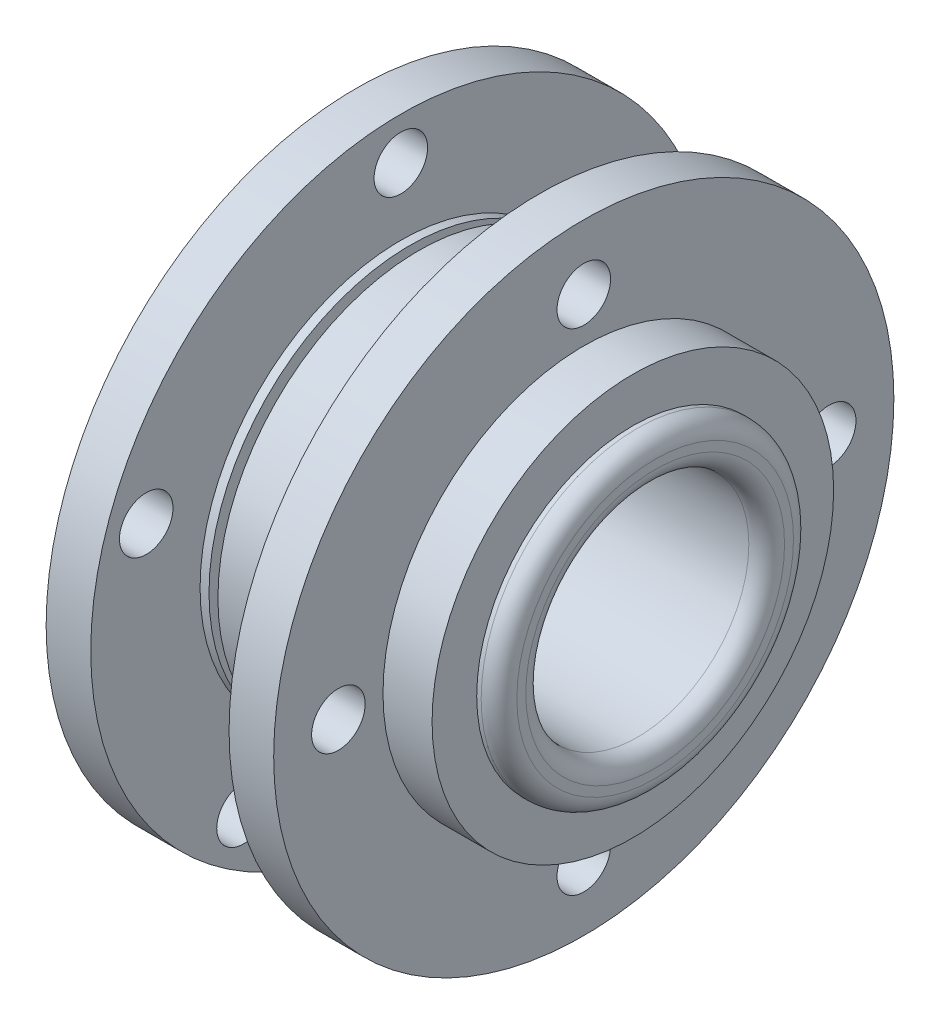
ISO-10303-21;
HEADER;
FILE_DESCRIPTION(('STEP AP214'),'2;1');
FILE_NAME('part.step','',(''),(''),'','','');
FILE_SCHEMA(('AUTOMOTIVE_DESIGN { 1 0 10303 214 1 1 1 1 }'));
ENDSEC;
DATA;
#1=APPLICATION_CONTEXT('core data for automotive mechanical design processes');
#2=APPLICATION_PROTOCOL_DEFINITION('international standard','automotive_design',2000,#1);
#3=PRODUCT_CONTEXT('',#1,'mechanical');
#4=PRODUCT('Part','Part','',(#3));
#5=PRODUCT_RELATED_PRODUCT_CATEGORY('part','',(#4));
#6=PRODUCT_DEFINITION_FORMATION('','',#4);
#7=PRODUCT_DEFINITION_CONTEXT('part definition',#1,'design');
#8=PRODUCT_DEFINITION('design','',#6,#7);
#9=PRODUCT_DEFINITION_SHAPE('','',#8);
#10=(LENGTH_UNIT() NAMED_UNIT(*) SI_UNIT(.MILLI.,.METRE.));
#11=(NAMED_UNIT(*) PLANE_ANGLE_UNIT() SI_UNIT($,.RADIAN.));
#12=(NAMED_UNIT(*) SI_UNIT($,.STERADIAN.) SOLID_ANGLE_UNIT());
#13=UNCERTAINTY_MEASURE_WITH_UNIT(LENGTH_MEASURE(1.E-05),#10,'distance_accuracy_value','');
#14=(GEOMETRIC_REPRESENTATION_CONTEXT(3) GLOBAL_UNCERTAINTY_ASSIGNED_CONTEXT((#13)) GLOBAL_UNIT_ASSIGNED_CONTEXT((#10,
#11,#12)) REPRESENTATION_CONTEXT('',''));
#15=CARTESIAN_POINT('',(0.,0.,0.));
#16=DIRECTION('',(0.,0.,1.));
#17=DIRECTION('',(1.,0.,0.));
#18=AXIS2_PLACEMENT_3D('',#15,#16,#17);
#19=CARTESIAN_POINT('',(0.,0.,0.));
#20=DIRECTION('',(-1.,0.,0.));
#21=DIRECTION('',(0.,0.,1.));
#22=AXIS2_PLACEMENT_3D('',#19,#20,#21);
#23=CYLINDRICAL_SURFACE('',#22,45.);
#24=CARTESIAN_POINT('',(25.,0.,0.));
#25=DIRECTION('',(-1.,0.,0.));
#26=DIRECTION('',(0.,0.,1.));
#27=AXIS2_PLACEMENT_3D('',#24,#25,#26);
#28=CIRCLE('',#27,45.);
#29=CARTESIAN_POINT('',(25.,0.,45.));
#30=VERTEX_POINT('',#29);
#31=EDGE_CURVE('E80',#30,#30,#28,.T.);
#32=ORIENTED_EDGE('',*,*,#31,.F.);
#33=EDGE_LOOP('',(#32));
#34=FACE_BOUND('',#33,.T.);
#35=CARTESIAN_POINT('',(27.,0.,0.));
#36=DIRECTION('',(-1.,0.,0.));
#37=DIRECTION('',(0.,0.,1.));
#38=AXIS2_PLACEMENT_3D('',#35,#36,#37);
#39=CIRCLE('',#38,45.);
#40=CARTESIAN_POINT('',(27.,0.,45.));
#41=VERTEX_POINT('',#40);
#42=EDGE_CURVE('E201',#41,#41,#39,.T.);
#43=ORIENTED_EDGE('',*,*,#42,.T.);
#44=EDGE_LOOP('',(#43));
#45=FACE_BOUND('',#44,.T.);
#46=ADVANCED_FACE('F36',(#34,#45),#23,.T.);
#47=CARTESIAN_POINT('',(56.,0.,0.));
#48=DIRECTION('',(-1.,0.,0.));
#49=DIRECTION('',(0.,0.,1.));
#50=AXIS2_PLACEMENT_3D('',#47,#48,#49);
#51=CIRCLE('',#50,45.);
#52=CARTESIAN_POINT('',(56.,0.,45.));
#53=VERTEX_POINT('',#52);
#54=EDGE_CURVE('E76',#53,#53,#51,.T.);
#55=ORIENTED_EDGE('',*,*,#54,.T.);
#56=EDGE_LOOP('',(#55));
#57=FACE_BOUND('',#56,.T.);
#58=CARTESIAN_POINT('',(29.,0.,0.));
#59=DIRECTION('',(-1.,0.,0.));
#60=DIRECTION('',(0.,0.,1.));
#61=AXIS2_PLACEMENT_3D('',#58,#59,#60);
#62=CIRCLE('',#61,45.);
#63=CARTESIAN_POINT('',(29.,0.,45.));
#64=VERTEX_POINT('',#63);
#65=EDGE_CURVE('E197',#64,#64,#62,.T.);
#66=ORIENTED_EDGE('',*,*,#65,.F.);
#67=EDGE_LOOP('',(#66));
#68=FACE_BOUND('',#67,.T.);
#69=ADVANCED_FACE('F222',(#57,#68),#23,.T.);
#70=CARTESIAN_POINT('',(0.,0.,0.));
#71=DIRECTION('',(-1.,0.,0.));
#72=DIRECTION('',(0.,0.,1.));
#73=AXIS2_PLACEMENT_3D('',#70,#71,#72);
#74=CYLINDRICAL_SURFACE('',#73,45.);
#75=CARTESIAN_POINT('',(66.,0.,0.));
#76=DIRECTION('',(-1.,0.,0.));
#77=DIRECTION('',(0.,0.,1.));
#78=AXIS2_PLACEMENT_3D('',#75,#76,#77);
#79=CIRCLE('',#78,45.);
#80=CARTESIAN_POINT('',(66.,0.,45.));
#81=VERTEX_POINT('',#80);
#82=EDGE_CURVE('E64',#81,#81,#79,.T.);
#83=ORIENTED_EDGE('',*,*,#82,.F.);
#84=EDGE_LOOP('',(#83));
#85=FACE_BOUND('',#84,.T.);
#86=CARTESIAN_POINT('',(77.,0.,0.));
#87=DIRECTION('',(1.,0.,0.));
#88=DIRECTION('',(0.,0.,-1.));
#89=AXIS2_PLACEMENT_3D('',#86,#87,#88);
#90=CIRCLE('',#89,45.);
#91=CARTESIAN_POINT('',(77.,0.,-45.));
#92=VERTEX_POINT('',#91);
#93=EDGE_CURVE('E174',#92,#92,#90,.T.);
#94=ORIENTED_EDGE('',*,*,#93,.F.);
#95=EDGE_LOOP('',(#94));
#96=FACE_BOUND('',#95,.T.);
#97=ADVANCED_FACE('F228',(#85,#96),#74,.T.);
#98=CARTESIAN_POINT('',(66.,45.,0.));
#99=DIRECTION('',(-1.,0.,0.));
#100=DIRECTION('',(0.,0.,1.));
#101=AXIS2_PLACEMENT_3D('',#98,#99,#100);
#102=PLANE('',#101);
#103=CARTESIAN_POINT('',(66.,55.,0.));
#104=DIRECTION('',(1.,0.,0.));
#105=DIRECTION('',(0.,0.,-1.));
#106=AXIS2_PLACEMENT_3D('',#103,#104,#105);
#107=CIRCLE('',#106,6.);
#108=CARTESIAN_POINT('',(66.,55.,-6.));
#109=VERTEX_POINT('',#108);
#110=EDGE_CURVE('E124',#109,#109,#107,.T.);
#111=ORIENTED_EDGE('',*,*,#110,.F.);
#112=EDGE_LOOP('',(#111));
#113=FACE_BOUND('',#112,.T.);
#114=CARTESIAN_POINT('',(66.,1.55309068257925E-12,-55.0000000000016));
#115=DIRECTION('',(1.,0.,0.));
#116=DIRECTION('',(0.,0.,-1.));
#117=AXIS2_PLACEMENT_3D('',#114,#115,#116);
#118=CIRCLE('',#117,6.00000000000121);
#119=CARTESIAN_POINT('',(66.,1.55309068257925E-12,-61.0000000000028));
#120=VERTEX_POINT('',#119);
#121=EDGE_CURVE('E116',#120,#120,#118,.T.);
#122=ORIENTED_EDGE('',*,*,#121,.F.);
#123=EDGE_LOOP('',(#122));
#124=FACE_BOUND('',#123,.T.);
#125=CARTESIAN_POINT('',(66.,-55.,-3.10618136515851E-12));
#126=DIRECTION('',(1.,0.,0.));
#127=DIRECTION('',(0.,0.,-1.));
#128=AXIS2_PLACEMENT_3D('',#125,#126,#127);
#129=CIRCLE('',#128,6.00000000000334);
#130=CARTESIAN_POINT('',(66.,-55.,-6.00000000000644));
#131=VERTEX_POINT('',#130);
#132=EDGE_CURVE('E109',#131,#131,#129,.T.);
#133=ORIENTED_EDGE('',*,*,#132,.F.);
#134=EDGE_LOOP('',(#133));
#135=FACE_BOUND('',#134,.T.);
#136=CARTESIAN_POINT('',(66.,-1.55982623997457E-12,54.9999999999985));
#137=DIRECTION('',(1.,0.,0.));
#138=DIRECTION('',(0.,0.,-1.));
#139=AXIS2_PLACEMENT_3D('',#136,#137,#138);
#140=CIRCLE('',#139,6.00000000000249);
#141=CARTESIAN_POINT('',(66.,-1.55982623997457E-12,48.999999999996));
#142=VERTEX_POINT('',#141);
#143=EDGE_CURVE('E100',#142,#142,#140,.T.);
#144=ORIENTED_EDGE('',*,*,#143,.F.);
#145=EDGE_LOOP('',(#144));
#146=FACE_BOUND('',#145,.T.);
#147=CARTESIAN_POINT('',(66.,0.,0.));
#148=DIRECTION('',(-1.,0.,0.));
#149=DIRECTION('',(0.,0.,1.));
#150=AXIS2_PLACEMENT_3D('',#147,#148,#149);
#151=CIRCLE('',#150,69.5);
#152=CARTESIAN_POINT('',(66.,0.,69.5));
#153=VERTEX_POINT('',#152);
#154=EDGE_CURVE('E68',#153,#153,#151,.T.);
#155=ORIENTED_EDGE('',*,*,#154,.F.);
#156=EDGE_LOOP('',(#155));
#157=FACE_BOUND('',#156,.T.);
#158=ORIENTED_EDGE('',*,*,#82,.T.);
#159=EDGE_LOOP('',(#158));
#160=FACE_BOUND('',#159,.T.);
#161=ADVANCED_FACE('F242',(#113,#124,#135,#146,#157,#160),#102,.F.);
#162=CARTESIAN_POINT('',(0.,0.,0.));
#163=DIRECTION('',(-1.,0.,0.));
#164=DIRECTION('',(0.,0.,1.));
#165=AXIS2_PLACEMENT_3D('',#162,#163,#164);
#166=CYLINDRICAL_SURFACE('',#165,69.5);
#167=CARTESIAN_POINT('',(56.,0.,0.));
#168=DIRECTION('',(-1.,0.,0.));
#169=DIRECTION('',(0.,0.,1.));
#170=AXIS2_PLACEMENT_3D('',#167,#168,#169);
#171=CIRCLE('',#170,69.5);
#172=CARTESIAN_POINT('',(56.,0.,69.5));
#173=VERTEX_POINT('',#172);
#174=EDGE_CURVE('E72',#173,#173,#171,.T.);
#175=ORIENTED_EDGE('',*,*,#174,.F.);
#176=EDGE_LOOP('',(#175));
#177=FACE_BOUND('',#176,.T.);
#178=ORIENTED_EDGE('',*,*,#154,.T.);
#179=EDGE_LOOP('',(#178));
#180=FACE_BOUND('',#179,.T.);
#181=ADVANCED_FACE('F238',(#177,#180),#166,.T.);
#182=CARTESIAN_POINT('',(56.,69.5,0.));
#183=DIRECTION('',(1.,0.,0.));
#184=DIRECTION('',(0.,0.,-1.));
#185=AXIS2_PLACEMENT_3D('',#182,#183,#184);
#186=PLANE('',#185);
#187=CARTESIAN_POINT('',(56.,55.,0.));
#188=DIRECTION('',(1.,0.,0.));
#189=DIRECTION('',(0.,0.,-1.));
#190=AXIS2_PLACEMENT_3D('',#187,#188,#189);
#191=CIRCLE('',#190,6.);
#192=CARTESIAN_POINT('',(56.,55.,-6.));
#193=VERTEX_POINT('',#192);
#194=EDGE_CURVE('E99',#193,#193,#191,.T.);
#195=ORIENTED_EDGE('',*,*,#194,.T.);
#196=EDGE_LOOP('',(#195));
#197=FACE_BOUND('',#196,.T.);
#198=CARTESIAN_POINT('',(56.,1.55309068257925E-12,-55.0000000000016));
#199=DIRECTION('',(1.,0.,0.));
#200=DIRECTION('',(0.,0.,-1.));
#201=AXIS2_PLACEMENT_3D('',#198,#199,#200);
#202=CIRCLE('',#201,6.00000000000121);
#203=CARTESIAN_POINT('',(56.,1.55309068257925E-12,-61.0000000000028));
#204=VERTEX_POINT('',#203);
#205=EDGE_CURVE('E120',#204,#204,#202,.T.);
#206=ORIENTED_EDGE('',*,*,#205,.T.);
#207=EDGE_LOOP('',(#206));
#208=FACE_BOUND('',#207,.T.);
#209=CARTESIAN_POINT('',(56.,-55.,-3.10618136515851E-12));
#210=DIRECTION('',(1.,0.,0.));
#211=DIRECTION('',(0.,0.,-1.));
#212=AXIS2_PLACEMENT_3D('',#209,#210,#211);
#213=CIRCLE('',#212,6.00000000000334);
#214=CARTESIAN_POINT('',(56.,-55.,-6.00000000000644));
#215=VERTEX_POINT('',#214);
#216=EDGE_CURVE('E113',#215,#215,#213,.T.);
#217=ORIENTED_EDGE('',*,*,#216,.T.);
#218=EDGE_LOOP('',(#217));
#219=FACE_BOUND('',#218,.T.);
#220=CARTESIAN_POINT('',(56.,-1.55982623997457E-12,54.9999999999985));
#221=DIRECTION('',(1.,0.,0.));
#222=DIRECTION('',(0.,0.,-1.));
#223=AXIS2_PLACEMENT_3D('',#220,#221,#222);
#224=CIRCLE('',#223,6.00000000000249);
#225=CARTESIAN_POINT('',(56.,-1.55982623997457E-12,48.999999999996));
#226=VERTEX_POINT('',#225);
#227=EDGE_CURVE('E104',#226,#226,#224,.T.);
#228=ORIENTED_EDGE('',*,*,#227,.T.);
#229=EDGE_LOOP('',(#228));
#230=FACE_BOUND('',#229,.T.);
#231=ORIENTED_EDGE('',*,*,#54,.F.);
#232=EDGE_LOOP('',(#231));
#233=FACE_BOUND('',#232,.T.);
#234=ORIENTED_EDGE('',*,*,#174,.T.);
#235=EDGE_LOOP('',(#234));
#236=FACE_BOUND('',#235,.T.);
#237=ADVANCED_FACE('F235',(#197,#208,#219,#230,#233,#236),#186,.F.);
#238=CARTESIAN_POINT('',(25.,45.,0.));
#239=DIRECTION('',(-1.,0.,0.));
#240=DIRECTION('',(0.,0.,1.));
#241=AXIS2_PLACEMENT_3D('',#238,#239,#240);
#242=PLANE('',#241);
#243=CARTESIAN_POINT('',(25.,60.,0.));
#244=DIRECTION('',(-1.,0.,0.));
#245=DIRECTION('',(0.,0.,1.));
#246=AXIS2_PLACEMENT_3D('',#243,#244,#245);
#247=CIRCLE('',#246,6.);
#248=CARTESIAN_POINT('',(25.,60.,6.));
#249=VERTEX_POINT('',#248);
#250=EDGE_CURVE('E105',#249,#249,#247,.T.);
#251=ORIENTED_EDGE('',*,*,#250,.T.);
#252=EDGE_LOOP('',(#251));
#253=FACE_BOUND('',#252,.T.);
#254=CARTESIAN_POINT('',(25.,18.5410196624993,57.063390977711));
#255=DIRECTION('',(-1.,0.,0.));
#256=DIRECTION('',(0.,0.,1.));
#257=AXIS2_PLACEMENT_3D('',#254,#255,#256);
#258=CIRCLE('',#257,6.00000000000114);
#259=CARTESIAN_POINT('',(25.,18.5410196624993,63.0633909777121));
#260=VERTEX_POINT('',#259);
#261=EDGE_CURVE('E159',#260,#260,#258,.T.);
#262=ORIENTED_EDGE('',*,*,#261,.T.);
#263=EDGE_LOOP('',(#262));
#264=FACE_BOUND('',#263,.T.);
#265=CARTESIAN_POINT('',(25.,-48.5410196624954,35.267115137553));
#266=DIRECTION('',(-1.,0.,0.));
#267=DIRECTION('',(0.,0.,1.));
#268=AXIS2_PLACEMENT_3D('',#265,#266,#267);
#269=CIRCLE('',#268,6.00000000000428);
#270=CARTESIAN_POINT('',(25.,-48.5410196624954,41.2671151375573));
#271=VERTEX_POINT('',#270);
#272=EDGE_CURVE('E151',#271,#271,#269,.T.);
#273=ORIENTED_EDGE('',*,*,#272,.T.);
#274=EDGE_LOOP('',(#273));
#275=FACE_BOUND('',#274,.T.);
#276=CARTESIAN_POINT('',(25.,-48.5410196624983,-35.2671151375438));
#277=DIRECTION('',(-1.,0.,0.));
#278=DIRECTION('',(0.,0.,1.));
#279=AXIS2_PLACEMENT_3D('',#276,#277,#278);
#280=CIRCLE('',#279,6.00000000000533);
#281=CARTESIAN_POINT('',(25.,-48.5410196624983,-29.2671151375385));
#282=VERTEX_POINT('',#281);
#283=EDGE_CURVE('E143',#282,#282,#280,.T.);
#284=ORIENTED_EDGE('',*,*,#283,.T.);
#285=EDGE_LOOP('',(#284));
#286=FACE_BOUND('',#285,.T.);
#287=CARTESIAN_POINT('',(25.,18.5410196624944,-57.0633909777075));
#288=DIRECTION('',(-1.,0.,0.));
#289=DIRECTION('',(0.,0.,1.));
#290=AXIS2_PLACEMENT_3D('',#287,#288,#289);
#291=CIRCLE('',#290,6.00000000000305);
#292=CARTESIAN_POINT('',(25.,18.5410196624944,-51.0633909777044));
#293=VERTEX_POINT('',#292);
#294=EDGE_CURVE('E135',#293,#293,#291,.T.);
#295=ORIENTED_EDGE('',*,*,#294,.T.);
#296=EDGE_LOOP('',(#295));
#297=FACE_BOUND('',#296,.T.);
#298=CARTESIAN_POINT('',(25.,0.,0.));
#299=DIRECTION('',(-1.,0.,0.));
#300=DIRECTION('',(0.,0.,1.));
#301=AXIS2_PLACEMENT_3D('',#298,#299,#300);
#302=CIRCLE('',#301,69.5);
#303=CARTESIAN_POINT('',(25.,0.,69.5));
#304=VERTEX_POINT('',#303);
#305=EDGE_CURVE('E84',#304,#304,#302,.T.);
#306=ORIENTED_EDGE('',*,*,#305,.F.);
#307=EDGE_LOOP('',(#306));
#308=FACE_BOUND('',#307,.T.);
#309=ORIENTED_EDGE('',*,*,#31,.T.);
#310=EDGE_LOOP('',(#309));
#311=FACE_BOUND('',#310,.T.);
#312=ADVANCED_FACE('F233',(#253,#264,#275,#286,#297,#308,#311),#242,.F.);
#313=CARTESIAN_POINT('',(0.,0.,0.));
#314=DIRECTION('',(-1.,0.,0.));
#315=DIRECTION('',(0.,0.,1.));
#316=AXIS2_PLACEMENT_3D('',#313,#314,#315);
#317=CYLINDRICAL_SURFACE('',#316,69.5);
#318=CARTESIAN_POINT('',(15.,0.,0.));
#319=DIRECTION('',(-1.,0.,0.));
#320=DIRECTION('',(0.,0.,1.));
#321=AXIS2_PLACEMENT_3D('',#318,#319,#320);
#322=CIRCLE('',#321,69.5);
#323=CARTESIAN_POINT('',(15.,0.,69.5));
#324=VERTEX_POINT('',#323);
#325=EDGE_CURVE('E88',#324,#324,#322,.T.);
#326=ORIENTED_EDGE('',*,*,#325,.F.);
#327=EDGE_LOOP('',(#326));
#328=FACE_BOUND('',#327,.T.);
#329=ORIENTED_EDGE('',*,*,#305,.T.);
#330=EDGE_LOOP('',(#329));
#331=FACE_BOUND('',#330,.T.);
#332=ADVANCED_FACE('F329',(#328,#331),#317,.T.);
#333=CARTESIAN_POINT('',(15.,69.5,0.));
#334=DIRECTION('',(1.,0.,0.));
#335=DIRECTION('',(0.,0.,-1.));
#336=AXIS2_PLACEMENT_3D('',#333,#334,#335);
#337=PLANE('',#336);
#338=CARTESIAN_POINT('',(15.,60.,0.));
#339=DIRECTION('',(-1.,0.,0.));
#340=DIRECTION('',(0.,0.,1.));
#341=AXIS2_PLACEMENT_3D('',#338,#339,#340);
#342=CIRCLE('',#341,6.);
#343=CARTESIAN_POINT('',(15.,60.,6.));
#344=VERTEX_POINT('',#343);
#345=EDGE_CURVE('E163',#344,#344,#342,.T.);
#346=ORIENTED_EDGE('',*,*,#345,.F.);
#347=EDGE_LOOP('',(#346));
#348=FACE_BOUND('',#347,.T.);
#349=CARTESIAN_POINT('',(15.,18.5410196624993,57.063390977711));
#350=DIRECTION('',(-1.,0.,0.));
#351=DIRECTION('',(0.,0.,1.));
#352=AXIS2_PLACEMENT_3D('',#349,#350,#351);
#353=CIRCLE('',#352,6.00000000000114);
#354=CARTESIAN_POINT('',(15.,18.5410196624993,63.0633909777121));
#355=VERTEX_POINT('',#354);
#356=EDGE_CURVE('E155',#355,#355,#353,.T.);
#357=ORIENTED_EDGE('',*,*,#356,.F.);
#358=EDGE_LOOP('',(#357));
#359=FACE_BOUND('',#358,.T.);
#360=CARTESIAN_POINT('',(15.,-48.5410196624954,35.267115137553));
#361=DIRECTION('',(-1.,0.,0.));
#362=DIRECTION('',(0.,0.,1.));
#363=AXIS2_PLACEMENT_3D('',#360,#361,#362);
#364=CIRCLE('',#363,6.00000000000428);
#365=CARTESIAN_POINT('',(15.,-48.5410196624954,41.2671151375573));
#366=VERTEX_POINT('',#365);
#367=EDGE_CURVE('E147',#366,#366,#364,.T.);
#368=ORIENTED_EDGE('',*,*,#367,.F.);
#369=EDGE_LOOP('',(#368));
#370=FACE_BOUND('',#369,.T.);
#371=CARTESIAN_POINT('',(15.,-48.5410196624983,-35.2671151375438));
#372=DIRECTION('',(-1.,0.,0.));
#373=DIRECTION('',(0.,0.,1.));
#374=AXIS2_PLACEMENT_3D('',#371,#372,#373);
#375=CIRCLE('',#374,6.00000000000533);
#376=CARTESIAN_POINT('',(15.,-48.5410196624983,-29.2671151375385));
#377=VERTEX_POINT('',#376);
#378=EDGE_CURVE('E140',#377,#377,#375,.T.);
#379=ORIENTED_EDGE('',*,*,#378,.F.);
#380=EDGE_LOOP('',(#379));
#381=FACE_BOUND('',#380,.T.);
#382=CARTESIAN_POINT('',(15.,18.5410196624944,-57.0633909777075));
#383=DIRECTION('',(-1.,0.,0.));
#384=DIRECTION('',(0.,0.,1.));
#385=AXIS2_PLACEMENT_3D('',#382,#383,#384);
#386=CIRCLE('',#385,6.00000000000305);
#387=CARTESIAN_POINT('',(15.,18.5410196624944,-51.0633909777044));
#388=VERTEX_POINT('',#387);
#389=EDGE_CURVE('E131',#388,#388,#386,.T.);
#390=ORIENTED_EDGE('',*,*,#389,.F.);
#391=EDGE_LOOP('',(#390));
#392=FACE_BOUND('',#391,.T.);
#393=CARTESIAN_POINT('',(15.,0.,0.));
#394=DIRECTION('',(-1.,0.,0.));
#395=DIRECTION('',(0.,0.,1.));
#396=AXIS2_PLACEMENT_3D('',#393,#394,#395);
#397=CIRCLE('',#396,39.5);
#398=CARTESIAN_POINT('',(15.,0.,39.5));
#399=VERTEX_POINT('',#398);
#400=EDGE_CURVE('E92',#399,#399,#397,.T.);
#401=ORIENTED_EDGE('',*,*,#400,.F.);
#402=EDGE_LOOP('',(#401));
#403=FACE_BOUND('',#402,.T.);
#404=ORIENTED_EDGE('',*,*,#325,.T.);
#405=EDGE_LOOP('',(#404));
#406=FACE_BOUND('',#405,.T.);
#407=ADVANCED_FACE('F326',(#348,#359,#370,#381,#392,#403,#406),#337,.F.);
#408=CARTESIAN_POINT('',(0.,0.,0.));
#409=DIRECTION('',(-1.,0.,0.));
#410=DIRECTION('',(0.,0.,1.));
#411=AXIS2_PLACEMENT_3D('',#408,#409,#410);
#412=CYLINDRICAL_SURFACE('',#411,39.5);
#413=CARTESIAN_POINT('',(0.,0.,0.));
#414=DIRECTION('',(-1.,0.,0.));
#415=DIRECTION('',(0.,0.,1.));
#416=AXIS2_PLACEMENT_3D('',#413,#414,#415);
#417=CIRCLE('',#416,39.5);
#418=CARTESIAN_POINT('',(0.,0.,39.5));
#419=VERTEX_POINT('',#418);
#420=EDGE_CURVE('E96',#419,#419,#417,.T.);
#421=ORIENTED_EDGE('',*,*,#420,.F.);
#422=EDGE_LOOP('',(#421));
#423=FACE_BOUND('',#422,.T.);
#424=ORIENTED_EDGE('',*,*,#400,.T.);
#425=EDGE_LOOP('',(#424));
#426=FACE_BOUND('',#425,.T.);
#427=ADVANCED_FACE('F322',(#423,#426),#412,.T.);
#428=CARTESIAN_POINT('',(0.,39.5,0.));
#429=DIRECTION('',(1.,0.,0.));
#430=DIRECTION('',(0.,0.,-1.));
#431=AXIS2_PLACEMENT_3D('',#428,#429,#430);
#432=PLANE('',#431);
#433=CARTESIAN_POINT('',(0.,0.,0.));
#434=DIRECTION('',(-1.,0.,0.));
#435=DIRECTION('',(0.,0.,1.));
#436=AXIS2_PLACEMENT_3D('',#433,#434,#435);
#437=CIRCLE('',#436,35.);
#438=CARTESIAN_POINT('',(0.,0.,35.));
#439=VERTEX_POINT('',#438);
#440=EDGE_CURVE('E170',#439,#439,#437,.T.);
#441=ORIENTED_EDGE('',*,*,#440,.F.);
#442=EDGE_LOOP('',(#441));
#443=FACE_BOUND('',#442,.T.);
#444=ORIENTED_EDGE('',*,*,#420,.T.);
#445=EDGE_LOOP('',(#444));
#446=FACE_BOUND('',#445,.T.);
#447=ADVANCED_FACE('F318',(#443,#446),#432,.F.);
#448=CARTESIAN_POINT('',(56.,-1.55982623997457E-12,54.9999999999985));
#449=DIRECTION('',(1.,0.,0.));
#450=DIRECTION('',(0.,0.,-1.));
#451=AXIS2_PLACEMENT_3D('',#448,#449,#450);
#452=CYLINDRICAL_SURFACE('',#451,6.00000000000249);
#453=ORIENTED_EDGE('',*,*,#227,.F.);
#454=EDGE_LOOP('',(#453));
#455=FACE_BOUND('',#454,.T.);
#456=ORIENTED_EDGE('',*,*,#143,.T.);
#457=EDGE_LOOP('',(#456));
#458=FACE_BOUND('',#457,.T.);
#459=ADVANCED_FACE('F314',(#455,#458),#452,.F.);
#460=CARTESIAN_POINT('',(56.,-55.,-3.10618136515851E-12));
#461=DIRECTION('',(1.,0.,0.));
#462=DIRECTION('',(0.,0.,-1.));
#463=AXIS2_PLACEMENT_3D('',#460,#461,#462);
#464=CYLINDRICAL_SURFACE('',#463,6.00000000000334);
#465=ORIENTED_EDGE('',*,*,#216,.F.);
#466=EDGE_LOOP('',(#465));
#467=FACE_BOUND('',#466,.T.);
#468=ORIENTED_EDGE('',*,*,#132,.T.);
#469=EDGE_LOOP('',(#468));
#470=FACE_BOUND('',#469,.T.);
#471=ADVANCED_FACE('F310',(#467,#470),#464,.F.);
#472=CARTESIAN_POINT('',(56.,1.55309068257925E-12,-55.0000000000016));
#473=DIRECTION('',(1.,0.,0.));
#474=DIRECTION('',(0.,0.,-1.));
#475=AXIS2_PLACEMENT_3D('',#472,#473,#474);
#476=CYLINDRICAL_SURFACE('',#475,6.00000000000121);
#477=ORIENTED_EDGE('',*,*,#205,.F.);
#478=EDGE_LOOP('',(#477));
#479=FACE_BOUND('',#478,.T.);
#480=ORIENTED_EDGE('',*,*,#121,.T.);
#481=EDGE_LOOP('',(#480));
#482=FACE_BOUND('',#481,.T.);
#483=ADVANCED_FACE('F306',(#479,#482),#476,.F.);
#484=CARTESIAN_POINT('',(56.,55.,0.));
#485=DIRECTION('',(1.,0.,0.));
#486=DIRECTION('',(0.,0.,-1.));
#487=AXIS2_PLACEMENT_3D('',#484,#485,#486);
#488=CYLINDRICAL_SURFACE('',#487,6.);
#489=ORIENTED_EDGE('',*,*,#194,.F.);
#490=EDGE_LOOP('',(#489));
#491=FACE_BOUND('',#490,.T.);
#492=ORIENTED_EDGE('',*,*,#110,.T.);
#493=EDGE_LOOP('',(#492));
#494=FACE_BOUND('',#493,.T.);
#495=ADVANCED_FACE('F302',(#491,#494),#488,.F.);
#496=CARTESIAN_POINT('',(25.,18.5410196624944,-57.0633909777075));
#497=DIRECTION('',(-1.,0.,0.));
#498=DIRECTION('',(0.,0.,1.));
#499=AXIS2_PLACEMENT_3D('',#496,#497,#498);
#500=CYLINDRICAL_SURFACE('',#499,6.00000000000305);
#501=ORIENTED_EDGE('',*,*,#294,.F.);
#502=EDGE_LOOP('',(#501));
#503=FACE_BOUND('',#502,.T.);
#504=ORIENTED_EDGE('',*,*,#389,.T.);
#505=EDGE_LOOP('',(#504));
#506=FACE_BOUND('',#505,.T.);
#507=ADVANCED_FACE('F298',(#503,#506),#500,.F.);
#508=CARTESIAN_POINT('',(25.,-48.5410196624983,-35.2671151375438));
#509=DIRECTION('',(-1.,0.,0.));
#510=DIRECTION('',(0.,0.,1.));
#511=AXIS2_PLACEMENT_3D('',#508,#509,#510);
#512=CYLINDRICAL_SURFACE('',#511,6.00000000000533);
#513=ORIENTED_EDGE('',*,*,#283,.F.);
#514=EDGE_LOOP('',(#513));
#515=FACE_BOUND('',#514,.T.);
#516=ORIENTED_EDGE('',*,*,#378,.T.);
#517=EDGE_LOOP('',(#516));
#518=FACE_BOUND('',#517,.T.);
#519=ADVANCED_FACE('F294',(#515,#518),#512,.F.);
#520=CARTESIAN_POINT('',(25.,-48.5410196624954,35.267115137553));
#521=DIRECTION('',(-1.,0.,0.));
#522=DIRECTION('',(0.,0.,1.));
#523=AXIS2_PLACEMENT_3D('',#520,#521,#522);
#524=CYLINDRICAL_SURFACE('',#523,6.00000000000428);
#525=ORIENTED_EDGE('',*,*,#272,.F.);
#526=EDGE_LOOP('',(#525));
#527=FACE_BOUND('',#526,.T.);
#528=ORIENTED_EDGE('',*,*,#367,.T.);
#529=EDGE_LOOP('',(#528));
#530=FACE_BOUND('',#529,.T.);
#531=ADVANCED_FACE('F290',(#527,#530),#524,.F.);
#532=CARTESIAN_POINT('',(25.,18.5410196624993,57.063390977711));
#533=DIRECTION('',(-1.,0.,0.));
#534=DIRECTION('',(0.,0.,1.));
#535=AXIS2_PLACEMENT_3D('',#532,#533,#534);
#536=CYLINDRICAL_SURFACE('',#535,6.00000000000114);
#537=ORIENTED_EDGE('',*,*,#261,.F.);
#538=EDGE_LOOP('',(#537));
#539=FACE_BOUND('',#538,.T.);
#540=ORIENTED_EDGE('',*,*,#356,.T.);
#541=EDGE_LOOP('',(#540));
#542=FACE_BOUND('',#541,.T.);
#543=ADVANCED_FACE('F286',(#539,#542),#536,.F.);
#544=CARTESIAN_POINT('',(25.,60.,0.));
#545=DIRECTION('',(-1.,0.,0.));
#546=DIRECTION('',(0.,0.,1.));
#547=AXIS2_PLACEMENT_3D('',#544,#545,#546);
#548=CYLINDRICAL_SURFACE('',#547,6.);
#549=ORIENTED_EDGE('',*,*,#250,.F.);
#550=EDGE_LOOP('',(#549));
#551=FACE_BOUND('',#550,.T.);
#552=ORIENTED_EDGE('',*,*,#345,.T.);
#553=EDGE_LOOP('',(#552));
#554=FACE_BOUND('',#553,.T.);
#555=ADVANCED_FACE('F282',(#551,#554),#548,.F.);
#556=CARTESIAN_POINT('',(15.,0.,0.));
#557=DIRECTION('',(-1.,0.,0.));
#558=DIRECTION('',(0.,0.,1.));
#559=AXIS2_PLACEMENT_3D('',#556,#557,#558);
#560=CYLINDRICAL_SURFACE('',#559,35.);
#561=CARTESIAN_POINT('',(15.,0.,0.));
#562=DIRECTION('',(-1.,0.,0.));
#563=DIRECTION('',(0.,0.,1.));
#564=AXIS2_PLACEMENT_3D('',#561,#562,#563);
#565=CIRCLE('',#564,35.);
#566=CARTESIAN_POINT('',(15.,0.,35.));
#567=VERTEX_POINT('',#566);
#568=EDGE_CURVE('E136',#567,#567,#565,.T.);
#569=ORIENTED_EDGE('',*,*,#568,.F.);
#570=EDGE_LOOP('',(#569));
#571=FACE_BOUND('',#570,.T.);
#572=ORIENTED_EDGE('',*,*,#440,.T.);
#573=EDGE_LOOP('',(#572));
#574=FACE_BOUND('',#573,.T.);
#575=ADVANCED_FACE('F278',(#571,#574),#560,.F.);
#576=CARTESIAN_POINT('',(15.,0.,0.));
#577=DIRECTION('',(-1.,0.,0.));
#578=DIRECTION('',(0.,0.,1.));
#579=AXIS2_PLACEMENT_3D('',#576,#577,#578);
#580=PLANE('',#579);
#581=CARTESIAN_POINT('',(15.,0.,0.));
#582=DIRECTION('',(-1.,0.,0.));
#583=DIRECTION('',(0.,0.,1.));
#584=AXIS2_PLACEMENT_3D('',#581,#582,#583);
#585=CIRCLE('',#584,25.);
#586=CARTESIAN_POINT('',(15.,0.,25.));
#587=VERTEX_POINT('',#586);
#588=EDGE_CURVE('E185',#587,#587,#585,.T.);
#589=ORIENTED_EDGE('',*,*,#588,.F.);
#590=EDGE_LOOP('',(#589));
#591=FACE_BOUND('',#590,.T.);
#592=ORIENTED_EDGE('',*,*,#568,.T.);
#593=EDGE_LOOP('',(#592));
#594=FACE_BOUND('',#593,.T.);
#595=ADVANCED_FACE('F274',(#591,#594),#580,.T.);
#596=CARTESIAN_POINT('',(77.,0.,0.));
#597=DIRECTION('',(1.,0.,0.));
#598=DIRECTION('',(0.,0.,-1.));
#599=AXIS2_PLACEMENT_3D('',#596,#597,#598);
#600=PLANE('',#599);
#601=CARTESIAN_POINT('',(77.,0.,0.));
#602=DIRECTION('',(1.,0.,0.));
#603=DIRECTION('',(0.,0.,-1.));
#604=AXIS2_PLACEMENT_3D('',#601,#602,#603);
#605=CIRCLE('',#604,35.);
#606=CARTESIAN_POINT('',(77.,0.,-35.));
#607=VERTEX_POINT('',#606);
#608=EDGE_CURVE('E181',#607,#607,#605,.T.);
#609=ORIENTED_EDGE('',*,*,#608,.F.);
#610=EDGE_LOOP('',(#609));
#611=FACE_BOUND('',#610,.T.);
#612=ORIENTED_EDGE('',*,*,#93,.T.);
#613=EDGE_LOOP('',(#612));
#614=FACE_BOUND('',#613,.T.);
#615=ADVANCED_FACE('F271',(#611,#614),#600,.T.);
#616=CARTESIAN_POINT('',(77.,0.,0.));
#617=DIRECTION('',(1.,0.,0.));
#618=DIRECTION('',(0.,0.,-1.));
#619=AXIS2_PLACEMENT_3D('',#616,#617,#618);
#620=CYLINDRICAL_SURFACE('',#619,35.);
#621=CARTESIAN_POINT('',(78.,0.,0.));
#622=DIRECTION('',(-1.,0.,0.));
#623=DIRECTION('',(0.,0.,1.));
#624=AXIS2_PLACEMENT_3D('',#621,#622,#623);
#625=CIRCLE('',#624,35.);
#626=CARTESIAN_POINT('',(78.,0.,35.));
#627=VERTEX_POINT('',#626);
#628=EDGE_CURVE('E44',#627,#627,#625,.T.);
#629=ORIENTED_EDGE('',*,*,#628,.T.);
#630=EDGE_LOOP('',(#629));
#631=FACE_BOUND('',#630,.T.);
#632=ORIENTED_EDGE('',*,*,#608,.T.);
#633=EDGE_LOOP('',(#632));
#634=FACE_BOUND('',#633,.T.);
#635=ADVANCED_FACE('F253',(#631,#634),#620,.T.);
#636=CARTESIAN_POINT('',(82.,0.,0.));
#637=DIRECTION('',(-1.,0.,0.));
#638=DIRECTION('',(0.,0.,1.));
#639=AXIS2_PLACEMENT_3D('',#636,#637,#638);
#640=PLANE('',#639);
#641=CARTESIAN_POINT('',(82.,0.,0.));
#642=DIRECTION('',(-1.,0.,0.));
#643=DIRECTION('',(0.,0.,1.));
#644=AXIS2_PLACEMENT_3D('',#641,#642,#643);
#645=CIRCLE('',#644,31.);
#646=CARTESIAN_POINT('',(82.,0.,31.));
#647=VERTEX_POINT('',#646);
#648=EDGE_CURVE('E51',#647,#647,#645,.F.);
#649=ORIENTED_EDGE('',*,*,#648,.T.);
#650=EDGE_LOOP('',(#649));
#651=FACE_BOUND('',#650,.T.);
#652=CARTESIAN_POINT('',(82.,0.,0.));
#653=DIRECTION('',(-1.,0.,0.));
#654=DIRECTION('',(0.,0.,1.));
#655=AXIS2_PLACEMENT_3D('',#652,#653,#654);
#656=CIRCLE('',#655,29.);
#657=CARTESIAN_POINT('',(82.,0.,29.));
#658=VERTEX_POINT('',#657);
#659=EDGE_CURVE('E58',#658,#658,#656,.T.);
#660=ORIENTED_EDGE('',*,*,#659,.T.);
#661=EDGE_LOOP('',(#660));
#662=FACE_BOUND('',#661,.T.);
#663=ADVANCED_FACE('F250',(#651,#662),#640,.F.);
#664=CARTESIAN_POINT('',(12.,0.,0.));
#665=DIRECTION('',(1.,0.,0.));
#666=DIRECTION('',(0.,0.,-1.));
#667=AXIS2_PLACEMENT_3D('',#664,#665,#666);
#668=CYLINDRICAL_SURFACE('',#667,25.);
#669=CARTESIAN_POINT('',(78.,0.,0.));
#670=DIRECTION('',(-1.,0.,0.));
#671=DIRECTION('',(0.,0.,1.));
#672=AXIS2_PLACEMENT_3D('',#669,#670,#671);
#673=CIRCLE('',#672,25.);
#674=CARTESIAN_POINT('',(78.,0.,25.));
#675=VERTEX_POINT('',#674);
#676=EDGE_CURVE('E10',#675,#675,#673,.F.);
#677=ORIENTED_EDGE('',*,*,#676,.T.);
#678=EDGE_LOOP('',(#677));
#679=FACE_BOUND('',#678,.T.);
#680=ORIENTED_EDGE('',*,*,#588,.T.);
#681=EDGE_LOOP('',(#680));
#682=FACE_BOUND('',#681,.T.);
#683=ADVANCED_FACE('F252',(#679,#682),#668,.F.);
#684=CARTESIAN_POINT('',(78.,0.,0.));
#685=DIRECTION('',(-1.,0.,0.));
#686=DIRECTION('',(0.,0.,1.));
#687=AXIS2_PLACEMENT_3D('',#684,#685,#686);
#688=TOROIDAL_SURFACE('',#687,31.,4.);
#689=ORIENTED_EDGE('',*,*,#628,.F.);
#690=EDGE_LOOP('',(#689));
#691=FACE_BOUND('',#690,.T.);
#692=ORIENTED_EDGE('',*,*,#648,.F.);
#693=EDGE_LOOP('',(#692));
#694=FACE_BOUND('',#693,.T.);
#695=ADVANCED_FACE('F218',(#691,#694),#688,.T.);
#696=CARTESIAN_POINT('',(78.,0.,0.));
#697=DIRECTION('',(-1.,0.,0.));
#698=DIRECTION('',(0.,0.,1.));
#699=AXIS2_PLACEMENT_3D('',#696,#697,#698);
#700=TOROIDAL_SURFACE('',#699,29.,4.);
#701=ORIENTED_EDGE('',*,*,#659,.F.);
#702=EDGE_LOOP('',(#701));
#703=FACE_BOUND('',#702,.T.);
#704=ORIENTED_EDGE('',*,*,#676,.F.);
#705=EDGE_LOOP('',(#704));
#706=FACE_BOUND('',#705,.T.);
#707=ADVANCED_FACE('F38',(#703,#706),#700,.T.);
#708=CARTESIAN_POINT('',(27.,45.,0.));
#709=DIRECTION('',(1.,0.,0.));
#710=DIRECTION('',(0.,0.,-1.));
#711=AXIS2_PLACEMENT_3D('',#708,#709,#710);
#712=PLANE('',#711);
#713=CARTESIAN_POINT('',(27.,0.,0.));
#714=DIRECTION('',(-1.,0.,0.));
#715=DIRECTION('',(0.,0.,1.));
#716=AXIS2_PLACEMENT_3D('',#713,#714,#715);
#717=CIRCLE('',#716,42.);
#718=CARTESIAN_POINT('',(27.,0.,42.));
#719=VERTEX_POINT('',#718);
#720=EDGE_CURVE('E189',#719,#719,#717,.T.);
#721=ORIENTED_EDGE('',*,*,#720,.T.);
#722=EDGE_LOOP('',(#721));
#723=FACE_BOUND('',#722,.T.);
#724=ORIENTED_EDGE('',*,*,#42,.F.);
#725=EDGE_LOOP('',(#724));
#726=FACE_BOUND('',#725,.T.);
#727=ADVANCED_FACE('F206',(#723,#726),#712,.T.);
#728=CARTESIAN_POINT('',(-4.1,0.,0.));
#729=DIRECTION('',(-1.,0.,0.));
#730=DIRECTION('',(0.,0.,1.));
#731=AXIS2_PLACEMENT_3D('',#728,#729,#730);
#732=CYLINDRICAL_SURFACE('',#731,42.);
#733=CARTESIAN_POINT('',(29.,0.,0.));
#734=DIRECTION('',(-1.,0.,0.));
#735=DIRECTION('',(0.,0.,1.));
#736=AXIS2_PLACEMENT_3D('',#733,#734,#735);
#737=CIRCLE('',#736,42.);
#738=CARTESIAN_POINT('',(29.,0.,42.));
#739=VERTEX_POINT('',#738);
#740=EDGE_CURVE('E193',#739,#739,#737,.T.);
#741=ORIENTED_EDGE('',*,*,#740,.T.);
#742=EDGE_LOOP('',(#741));
#743=FACE_BOUND('',#742,.T.);
#744=ORIENTED_EDGE('',*,*,#720,.F.);
#745=EDGE_LOOP('',(#744));
#746=FACE_BOUND('',#745,.T.);
#747=ADVANCED_FACE('F208',(#743,#746),#732,.T.);
#748=CARTESIAN_POINT('',(29.,45.,0.));
#749=DIRECTION('',(-1.,0.,0.));
#750=DIRECTION('',(0.,0.,1.));
#751=AXIS2_PLACEMENT_3D('',#748,#749,#750);
#752=PLANE('',#751);
#753=ORIENTED_EDGE('',*,*,#65,.T.);
#754=EDGE_LOOP('',(#753));
#755=FACE_BOUND('',#754,.T.);
#756=ORIENTED_EDGE('',*,*,#740,.F.);
#757=EDGE_LOOP('',(#756));
#758=FACE_BOUND('',#757,.T.);
#759=ADVANCED_FACE('F215',(#755,#758),#752,.T.);
#760=CLOSED_SHELL('',(#46,#69,#97,#161,#181,#237,#312,#332,#407,#427,#447,#459,#471,#483,#495,
#507,#519,#531,#543,#555,#575,#595,#615,#635,#663,#683,#695,#707,#727,#747,#759));
#761=MANIFOLD_SOLID_BREP('B2',#760);
#762=ADVANCED_BREP_SHAPE_REPRESENTATION('',(#18,#761),#14);
#763=SHAPE_DEFINITION_REPRESENTATION(#9,#762);
ENDSEC;
END-ISO-10303-21;
